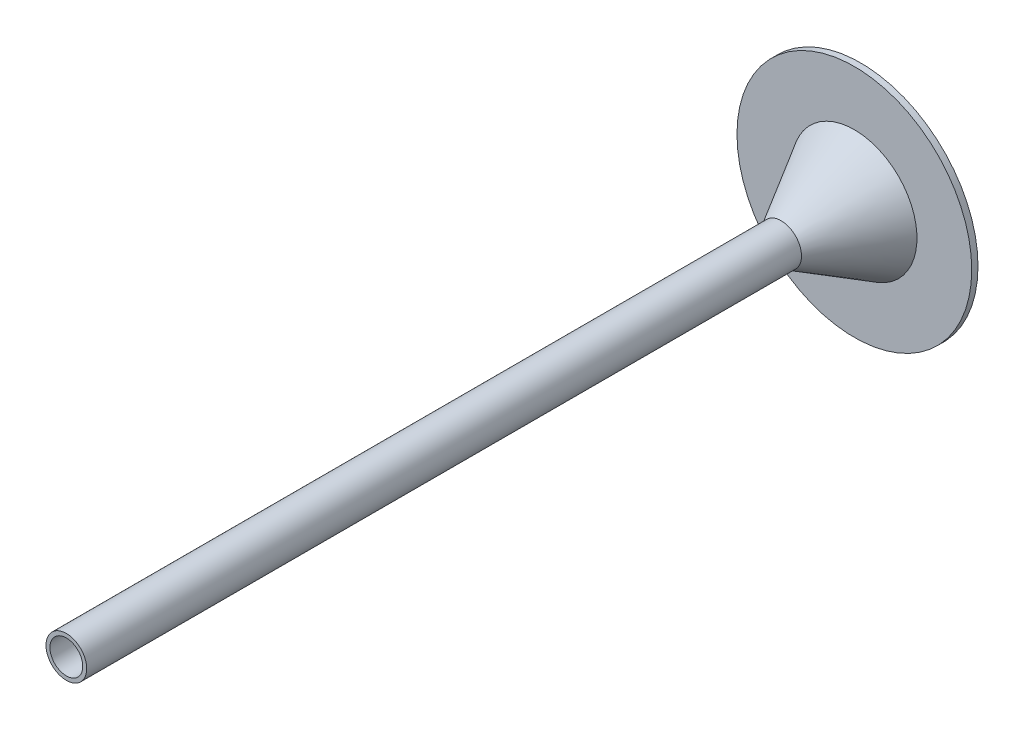
ISO-10303-21;
HEADER;
FILE_DESCRIPTION(('STEP AP214'),'2;1');
FILE_NAME('part.step','',(''),(''),'','','');
FILE_SCHEMA(('AUTOMOTIVE_DESIGN { 1 0 10303 214 1 1 1 1 }'));
ENDSEC;
DATA;
#1=APPLICATION_CONTEXT('core data for automotive mechanical design processes');
#2=APPLICATION_PROTOCOL_DEFINITION('international standard','automotive_design',2000,#1);
#3=PRODUCT_CONTEXT('',#1,'mechanical');
#4=PRODUCT('Part','Part','',(#3));
#5=PRODUCT_RELATED_PRODUCT_CATEGORY('part','',(#4));
#6=PRODUCT_DEFINITION_FORMATION('','',#4);
#7=PRODUCT_DEFINITION_CONTEXT('part definition',#1,'design');
#8=PRODUCT_DEFINITION('design','',#6,#7);
#9=PRODUCT_DEFINITION_SHAPE('','',#8);
#10=(LENGTH_UNIT() NAMED_UNIT(*) SI_UNIT(.MILLI.,.METRE.));
#11=(NAMED_UNIT(*) PLANE_ANGLE_UNIT() SI_UNIT($,.RADIAN.));
#12=(NAMED_UNIT(*) SI_UNIT($,.STERADIAN.) SOLID_ANGLE_UNIT());
#13=UNCERTAINTY_MEASURE_WITH_UNIT(LENGTH_MEASURE(1.E-05),#10,'distance_accuracy_value','');
#14=(GEOMETRIC_REPRESENTATION_CONTEXT(3) GLOBAL_UNCERTAINTY_ASSIGNED_CONTEXT((#13)) GLOBAL_UNIT_ASSIGNED_CONTEXT((#10,
#11,#12)) REPRESENTATION_CONTEXT('',''));
#15=CARTESIAN_POINT('',(0.,0.,0.));
#16=DIRECTION('',(0.,0.,1.));
#17=DIRECTION('',(1.,0.,0.));
#18=AXIS2_PLACEMENT_3D('',#15,#16,#17);
#19=CARTESIAN_POINT('',(0.,0.,1.6));
#20=DIRECTION('',(0.,0.,1.));
#21=DIRECTION('',(1.,0.,0.));
#22=AXIS2_PLACEMENT_3D('',#19,#20,#21);
#23=PLANE('',#22);
#24=CARTESIAN_POINT('',(0.,0.,1.6));
#25=DIRECTION('',(0.,0.,1.));
#26=DIRECTION('',(1.,0.,0.));
#27=AXIS2_PLACEMENT_3D('',#24,#25,#26);
#28=CIRCLE('',#27,16.);
#29=CARTESIAN_POINT('',(-16.,0.,1.6));
#30=VERTEX_POINT('',#29);
#31=EDGE_CURVE('E10',#30,#30,#28,.T.);
#32=ORIENTED_EDGE('',*,*,#31,.F.);
#33=EDGE_LOOP('',(#32));
#34=FACE_BOUND('',#33,.T.);
#35=CARTESIAN_POINT('',(0.,0.,1.6));
#36=DIRECTION('',(0.,0.,1.));
#37=DIRECTION('',(1.,0.,0.));
#38=AXIS2_PLACEMENT_3D('',#35,#36,#37);
#39=CIRCLE('',#38,30.);
#40=CARTESIAN_POINT('',(30.,0.,1.6));
#41=VERTEX_POINT('',#40);
#42=EDGE_CURVE('E38',#41,#41,#39,.T.);
#43=ORIENTED_EDGE('',*,*,#42,.T.);
#44=EDGE_LOOP('',(#43));
#45=FACE_BOUND('',#44,.T.);
#46=ADVANCED_FACE('F31',(#34,#45),#23,.T.);
#47=CARTESIAN_POINT('',(0.,0.,0.));
#48=DIRECTION('',(0.,0.,1.));
#49=DIRECTION('',(1.,0.,0.));
#50=AXIS2_PLACEMENT_3D('',#47,#48,#49);
#51=PLANE('',#50);
#52=CARTESIAN_POINT('',(0.,0.,0.));
#53=DIRECTION('',(0.,0.,1.));
#54=DIRECTION('',(1.,0.,0.));
#55=AXIS2_PLACEMENT_3D('',#52,#53,#54);
#56=CIRCLE('',#55,30.);
#57=CARTESIAN_POINT('',(30.,0.,0.));
#58=VERTEX_POINT('',#57);
#59=EDGE_CURVE('E42',#58,#58,#56,.T.);
#60=ORIENTED_EDGE('',*,*,#59,.F.);
#61=EDGE_LOOP('',(#60));
#62=FACE_BOUND('',#61,.T.);
#63=CARTESIAN_POINT('',(0.,0.,0.));
#64=DIRECTION('',(0.,0.,1.));
#65=DIRECTION('',(1.,0.,0.));
#66=AXIS2_PLACEMENT_3D('',#63,#64,#65);
#67=CIRCLE('',#66,15.);
#68=CARTESIAN_POINT('',(15.,0.,0.));
#69=VERTEX_POINT('',#68);
#70=EDGE_CURVE('E47',#69,#69,#67,.T.);
#71=ORIENTED_EDGE('',*,*,#70,.T.);
#72=EDGE_LOOP('',(#71));
#73=FACE_BOUND('',#72,.T.);
#74=ADVANCED_FACE('F85',(#62,#73),#51,.F.);
#75=CARTESIAN_POINT('',(0.,0.,1.6));
#76=DIRECTION('',(0.,0.,-1.));
#77=DIRECTION('',(-1.,0.,0.));
#78=AXIS2_PLACEMENT_3D('',#75,#76,#77);
#79=CYLINDRICAL_SURFACE('',#78,30.);
#80=ORIENTED_EDGE('',*,*,#42,.F.);
#81=EDGE_LOOP('',(#80));
#82=FACE_BOUND('',#81,.T.);
#83=ORIENTED_EDGE('',*,*,#59,.T.);
#84=EDGE_LOOP('',(#83));
#85=FACE_BOUND('',#84,.T.);
#86=ADVANCED_FACE('F33',(#82,#85),#79,.T.);
#87=CARTESIAN_POINT('',(0.,0.,1.6));
#88=DIRECTION('',(0.,0.,-1.));
#89=DIRECTION('',(-1.,0.,0.));
#90=AXIS2_PLACEMENT_3D('',#87,#88,#89);
#91=CYLINDRICAL_SURFACE('',#90,15.);
#92=CARTESIAN_POINT('',(0.,0.,1.6));
#93=DIRECTION('',(0.,0.,-1.));
#94=DIRECTION('',(-1.,0.,0.));
#95=AXIS2_PLACEMENT_3D('',#92,#93,#94);
#96=CIRCLE('',#95,15.);
#97=CARTESIAN_POINT('',(-15.,0.,1.6));
#98=VERTEX_POINT('',#97);
#99=EDGE_CURVE('E51',#98,#98,#96,.T.);
#100=ORIENTED_EDGE('',*,*,#99,.F.);
#101=EDGE_LOOP('',(#100));
#102=FACE_BOUND('',#101,.T.);
#103=ORIENTED_EDGE('',*,*,#70,.F.);
#104=EDGE_LOOP('',(#103));
#105=FACE_BOUND('',#104,.T.);
#106=ADVANCED_FACE('F93',(#102,#105),#91,.F.);
#107=CARTESIAN_POINT('',(0.,0.,20.3061487217437));
#108=DIRECTION('',(0.,0.,-1.));
#109=DIRECTION('',(-1.,0.,0.));
#110=AXIS2_PLACEMENT_3D('',#107,#108,#109);
#111=CONICAL_SURFACE('',#110,4.2,0.523598775598304);
#112=CARTESIAN_POINT('',(0.,0.,20.3061487217437));
#113=DIRECTION('',(0.,0.,-1.));
#114=DIRECTION('',(-1.,0.,0.));
#115=AXIS2_PLACEMENT_3D('',#112,#113,#114);
#116=CIRCLE('',#115,4.2);
#117=CARTESIAN_POINT('',(-4.2,0.,20.3061487217437));
#118=VERTEX_POINT('',#117);
#119=EDGE_CURVE('E54',#118,#118,#116,.T.);
#120=CARTESIAN_POINT('',(-15.,0.,1.6));
#121=CARTESIAN_POINT('',(-14.8875,0.,1.79485571585149));
#122=CARTESIAN_POINT('',(-14.775,0.,1.98971143170299));
#123=CARTESIAN_POINT('',(-14.55,0.,2.37942286340598));
#124=CARTESIAN_POINT('',(-14.4375,0.,2.57427857925748));
#125=CARTESIAN_POINT('',(-14.2125,0.,2.96399001096047));
#126=CARTESIAN_POINT('',(-14.1,0.,3.15884572681197));
#127=CARTESIAN_POINT('',(-13.875,0.,3.54855715851496));
#128=CARTESIAN_POINT('',(-13.7625,0.,3.74341287436646));
#129=CARTESIAN_POINT('',(-13.5375,0.,4.13312430606945));
#130=CARTESIAN_POINT('',(-13.425,0.,4.32798002192095));
#131=CARTESIAN_POINT('',(-13.2,0.,4.71769145362394));
#132=CARTESIAN_POINT('',(-13.0875,0.,4.91254716947543));
#133=CARTESIAN_POINT('',(-12.8625,0.,5.30225860117843));
#134=CARTESIAN_POINT('',(-12.75,0.,5.49711431702992));
#135=CARTESIAN_POINT('',(-12.525,0.,5.88682574873292));
#136=CARTESIAN_POINT('',(-12.4125,0.,6.08168146458441));
#137=CARTESIAN_POINT('',(-12.1875,0.,6.47139289628741));
#138=CARTESIAN_POINT('',(-12.075,0.,6.6662486121389));
#139=CARTESIAN_POINT('',(-11.85,0.,7.0559600438419));
#140=CARTESIAN_POINT('',(-11.7375,0.,7.25081575969339));
#141=CARTESIAN_POINT('',(-11.5125,0.,7.64052719139639));
#142=CARTESIAN_POINT('',(-11.4,0.,7.83538290724788));
#143=CARTESIAN_POINT('',(-11.175,0.,8.22509433895088));
#144=CARTESIAN_POINT('',(-11.0625,0.,8.41995005480237));
#145=CARTESIAN_POINT('',(-10.8375,0.,8.80966148650537));
#146=CARTESIAN_POINT('',(-10.725,0.,9.00451720235686));
#147=CARTESIAN_POINT('',(-10.5,0.,9.39422863405985));
#148=CARTESIAN_POINT('',(-10.3875,0.,9.58908434991135));
#149=CARTESIAN_POINT('',(-10.1625,0.,9.97879578161434));
#150=CARTESIAN_POINT('',(-10.05,0.,10.1736514974658));
#151=CARTESIAN_POINT('',(-9.825,0.,10.5633629291688));
#152=CARTESIAN_POINT('',(-9.7125,0.,10.7582186450203));
#153=CARTESIAN_POINT('',(-9.4875,0.,11.1479300767233));
#154=CARTESIAN_POINT('',(-9.375,0.,11.3427857925748));
#155=CARTESIAN_POINT('',(-9.15,0.,11.7324972242778));
#156=CARTESIAN_POINT('',(-9.0375,0.,11.9273529401293));
#157=CARTESIAN_POINT('',(-8.8125,0.,12.3170643718323));
#158=CARTESIAN_POINT('',(-8.7,0.,12.5119200876838));
#159=CARTESIAN_POINT('',(-8.475,0.,12.9016315193868));
#160=CARTESIAN_POINT('',(-8.3625,0.,13.0964872352383));
#161=CARTESIAN_POINT('',(-8.1375,0.,13.4861986669413));
#162=CARTESIAN_POINT('',(-8.025,0.,13.6810543827928));
#163=CARTESIAN_POINT('',(-7.8,0.,14.0707658144958));
#164=CARTESIAN_POINT('',(-7.6875,0.,14.2656215303473));
#165=CARTESIAN_POINT('',(-7.4625,0.,14.6553329620503));
#166=CARTESIAN_POINT('',(-7.35,0.,14.8501886779018));
#167=CARTESIAN_POINT('',(-7.125,0.,15.2399001096048));
#168=CARTESIAN_POINT('',(-7.0125,0.,15.4347558254562));
#169=CARTESIAN_POINT('',(-6.7875,0.,15.8244672571592));
#170=CARTESIAN_POINT('',(-6.675,0.,16.0193229730107));
#171=CARTESIAN_POINT('',(-6.45,0.,16.4090344047137));
#172=CARTESIAN_POINT('',(-6.3375,0.,16.6038901205652));
#173=CARTESIAN_POINT('',(-6.1125,0.,16.9936015522682));
#174=CARTESIAN_POINT('',(-6.,0.,17.1884572681197));
#175=CARTESIAN_POINT('',(-5.775,0.,17.5781686998227));
#176=CARTESIAN_POINT('',(-5.6625,0.,17.7730244156742));
#177=CARTESIAN_POINT('',(-5.4375,0.,18.1627358473772));
#178=CARTESIAN_POINT('',(-5.325,0.,18.3575915632287));
#179=CARTESIAN_POINT('',(-5.1,0.,18.7473029949317));
#180=CARTESIAN_POINT('',(-4.9875,0.,18.9421587107832));
#181=CARTESIAN_POINT('',(-4.76249999999999,0.,19.3318701424862));
#182=CARTESIAN_POINT('',(-4.65,0.,19.5267258583377));
#183=CARTESIAN_POINT('',(-4.425,0.,19.9164372900407));
#184=CARTESIAN_POINT('',(-4.3125,0.,20.1112930058922));
#185=CARTESIAN_POINT('',(-4.2,0.,20.3061487217437));
#186=B_SPLINE_CURVE_WITH_KNOTS('',3,(#120,#121,#122,#123,#124,#125,#126,#127,#128,#129,#130,
#131,#132,#133,#134,#135,#136,#137,#138,#139,#140,#141,#142,#143,#144,#145,#146,#147,#148,#149,
#150,#151,#152,#153,#154,#155,#156,#157,#158,#159,#160,#161,#162,#163,#164,#165,#166,#167,#168,
#169,#170,#171,#172,#173,#174,#175,#176,#177,#178,#179,#180,#181,#182,#183,#184,#185),
.UNSPECIFIED.,.F.,.F.,(4,2,2,2,2,2,2,2,2,2,2,2,2,2,2,2,2,2,2,2,2,2,2,2,2,2,2,2,2,2,2,2,4),(0.,
0.674999999999996,1.34999999999999,2.02499999999998,2.69999999999998,3.37499999999997,
4.04999999999996,4.72499999999996,5.39999999999995,6.07499999999995,6.74999999999994,
7.42499999999994,8.09999999999993,8.77499999999993,9.44999999999992,10.1249999999999,
10.7999999999999,11.4749999999999,12.1499999999999,12.8249999999999,13.4999999999999,
14.1749999999999,14.8499999999999,15.5249999999999,16.1999999999999,16.8749999999999,
17.5499999999999,18.2249999999998,18.8999999999998,19.5749999999998,20.2499999999998,
20.9249999999998,21.5999999999998),.UNSPECIFIED.);
#187=EDGE_CURVE('BSEAM81',#98,#118,#186,.T.);
#188=ORIENTED_EDGE('',*,*,#99,.T.);
#189=ORIENTED_EDGE('',*,*,#119,.F.);
#190=ORIENTED_EDGE('',*,*,#187,.T.);
#191=ORIENTED_EDGE('',*,*,#187,.F.);
#192=EDGE_LOOP('',(#188,#190,#189,#191));
#193=FACE_BOUND('',#192,.T.);
#194=ADVANCED_FACE('F81',(#193),#111,.F.);
#195=CARTESIAN_POINT('',(0.,0.,1.6));
#196=DIRECTION('',(0.,0.,-1.));
#197=DIRECTION('',(-1.,0.,0.));
#198=AXIS2_PLACEMENT_3D('',#195,#196,#197);
#199=CONICAL_SURFACE('',#198,16.,0.523598775598304);
#200=CARTESIAN_POINT('',(0.,0.,20.3061487217437));
#201=DIRECTION('',(0.,0.,1.));
#202=DIRECTION('',(1.,0.,0.));
#203=AXIS2_PLACEMENT_3D('',#200,#201,#202);
#204=CIRCLE('',#203,5.2);
#205=CARTESIAN_POINT('',(-5.2,0.,20.3061487217437));
#206=VERTEX_POINT('',#205);
#207=EDGE_CURVE('E61',#206,#206,#204,.T.);
#208=CARTESIAN_POINT('',(-5.2,0.,20.3061487217437));
#209=CARTESIAN_POINT('',(-5.3125,0.,20.1112930058922));
#210=CARTESIAN_POINT('',(-5.425,0.,19.9164372900407));
#211=CARTESIAN_POINT('',(-5.65,0.,19.5267258583377));
#212=CARTESIAN_POINT('',(-5.7625,0.,19.3318701424862));
#213=CARTESIAN_POINT('',(-5.9875,0.,18.9421587107832));
#214=CARTESIAN_POINT('',(-6.1,0.,18.7473029949317));
#215=CARTESIAN_POINT('',(-6.325,0.,18.3575915632287));
#216=CARTESIAN_POINT('',(-6.4375,0.,18.1627358473772));
#217=CARTESIAN_POINT('',(-6.6625,0.,17.7730244156742));
#218=CARTESIAN_POINT('',(-6.775,0.,17.5781686998227));
#219=CARTESIAN_POINT('',(-7.,0.,17.1884572681197));
#220=CARTESIAN_POINT('',(-7.1125,0.,16.9936015522682));
#221=CARTESIAN_POINT('',(-7.3375,0.,16.6038901205652));
#222=CARTESIAN_POINT('',(-7.45,0.,16.4090344047137));
#223=CARTESIAN_POINT('',(-7.675,0.,16.0193229730107));
#224=CARTESIAN_POINT('',(-7.7875,0.,15.8244672571592));
#225=CARTESIAN_POINT('',(-8.0125,0.,15.4347558254563));
#226=CARTESIAN_POINT('',(-8.125,0.,15.2399001096048));
#227=CARTESIAN_POINT('',(-8.35,0.,14.8501886779018));
#228=CARTESIAN_POINT('',(-8.4625,0.,14.6553329620503));
#229=CARTESIAN_POINT('',(-8.6875,0.,14.2656215303473));
#230=CARTESIAN_POINT('',(-8.8,0.,14.0707658144958));
#231=CARTESIAN_POINT('',(-9.025,0.,13.6810543827928));
#232=CARTESIAN_POINT('',(-9.1375,0.,13.4861986669413));
#233=CARTESIAN_POINT('',(-9.3625,0.,13.0964872352383));
#234=CARTESIAN_POINT('',(-9.475,0.,12.9016315193868));
#235=CARTESIAN_POINT('',(-9.7,0.,12.5119200876838));
#236=CARTESIAN_POINT('',(-9.8125,0.,12.3170643718323));
#237=CARTESIAN_POINT('',(-10.0375,0.,11.9273529401293));
#238=CARTESIAN_POINT('',(-10.15,0.,11.7324972242778));
#239=CARTESIAN_POINT('',(-10.375,0.,11.3427857925748));
#240=CARTESIAN_POINT('',(-10.4875,0.,11.1479300767233));
#241=CARTESIAN_POINT('',(-10.7125,0.,10.7582186450203));
#242=CARTESIAN_POINT('',(-10.825,0.,10.5633629291688));
#243=CARTESIAN_POINT('',(-11.05,0.,10.1736514974658));
#244=CARTESIAN_POINT('',(-11.1625,0.,9.97879578161435));
#245=CARTESIAN_POINT('',(-11.3875,0.,9.58908434991135));
#246=CARTESIAN_POINT('',(-11.5,0.,9.39422863405986));
#247=CARTESIAN_POINT('',(-11.725,0.,9.00451720235687));
#248=CARTESIAN_POINT('',(-11.8375,0.,8.80966148650537));
#249=CARTESIAN_POINT('',(-12.0625,0.,8.41995005480238));
#250=CARTESIAN_POINT('',(-12.175,0.,8.22509433895088));
#251=CARTESIAN_POINT('',(-12.4,0.,7.83538290724789));
#252=CARTESIAN_POINT('',(-12.5125,0.,7.64052719139639));
#253=CARTESIAN_POINT('',(-12.7375,0.,7.2508157596934));
#254=CARTESIAN_POINT('',(-12.85,0.,7.0559600438419));
#255=CARTESIAN_POINT('',(-13.075,0.,6.66624861213891));
#256=CARTESIAN_POINT('',(-13.1875,0.,6.47139289628741));
#257=CARTESIAN_POINT('',(-13.4125,0.,6.08168146458442));
#258=CARTESIAN_POINT('',(-13.525,0.,5.88682574873292));
#259=CARTESIAN_POINT('',(-13.75,0.,5.49711431702993));
#260=CARTESIAN_POINT('',(-13.8625,0.,5.30225860117843));
#261=CARTESIAN_POINT('',(-14.0875,0.,4.91254716947544));
#262=CARTESIAN_POINT('',(-14.2,0.,4.71769145362394));
#263=CARTESIAN_POINT('',(-14.425,0.,4.32798002192095));
#264=CARTESIAN_POINT('',(-14.5375,0.,4.13312430606945));
#265=CARTESIAN_POINT('',(-14.7625,0.,3.74341287436646));
#266=CARTESIAN_POINT('',(-14.875,0.,3.54855715851496));
#267=CARTESIAN_POINT('',(-15.1,0.,3.15884572681197));
#268=CARTESIAN_POINT('',(-15.2125,0.,2.96399001096047));
#269=CARTESIAN_POINT('',(-15.4375,0.,2.57427857925748));
#270=CARTESIAN_POINT('',(-15.55,0.,2.37942286340599));
#271=CARTESIAN_POINT('',(-15.775,0.,1.98971143170299));
#272=CARTESIAN_POINT('',(-15.8875,0.,1.7948557158515));
#273=CARTESIAN_POINT('',(-16.,0.,1.6));
#274=B_SPLINE_CURVE_WITH_KNOTS('',3,(#208,#209,#210,#211,#212,#213,#214,#215,#216,#217,#218,
#219,#220,#221,#222,#223,#224,#225,#226,#227,#228,#229,#230,#231,#232,#233,#234,#235,#236,#237,
#238,#239,#240,#241,#242,#243,#244,#245,#246,#247,#248,#249,#250,#251,#252,#253,#254,#255,#256,
#257,#258,#259,#260,#261,#262,#263,#264,#265,#266,#267,#268,#269,#270,#271,#272,#273),
.UNSPECIFIED.,.F.,.F.,(4,2,2,2,2,2,2,2,2,2,2,2,2,2,2,2,2,2,2,2,2,2,2,2,2,2,2,2,2,2,2,2,4),(0.,
0.674999999999996,1.34999999999999,2.02499999999998,2.69999999999998,3.37499999999997,
4.04999999999997,4.72499999999996,5.39999999999995,6.07499999999995,6.74999999999994,
7.42499999999994,8.09999999999993,8.77499999999993,9.44999999999992,10.1249999999999,
10.7999999999999,11.4749999999999,12.1499999999999,12.8249999999999,13.4999999999999,
14.1749999999999,14.8499999999999,15.5249999999999,16.1999999999999,16.8749999999999,
17.5499999999999,18.2249999999998,18.8999999999998,19.5749999999998,20.2499999999998,
20.9249999999998,21.5999999999998),.UNSPECIFIED.);
#275=EDGE_CURVE('BSEAM72',#206,#30,#274,.T.);
#276=ORIENTED_EDGE('',*,*,#207,.F.);
#277=ORIENTED_EDGE('',*,*,#31,.T.);
#278=ORIENTED_EDGE('',*,*,#275,.T.);
#279=ORIENTED_EDGE('',*,*,#275,.F.);
#280=EDGE_LOOP('',(#276,#278,#277,#279));
#281=FACE_BOUND('',#280,.T.);
#282=ADVANCED_FACE('F72',(#281),#199,.T.);
#283=CARTESIAN_POINT('',(0.,0.,217.70782104868));
#284=DIRECTION('',(0.,0.,-1.));
#285=DIRECTION('',(-1.,0.,0.));
#286=AXIS2_PLACEMENT_3D('',#283,#284,#285);
#287=CYLINDRICAL_SURFACE('',#286,5.2);
#288=CARTESIAN_POINT('',(0.,0.,203.));
#289=DIRECTION('',(0.,0.,1.));
#290=DIRECTION('',(1.,0.,0.));
#291=AXIS2_PLACEMENT_3D('',#288,#289,#290);
#292=CIRCLE('',#291,5.2);
#293=CARTESIAN_POINT('',(-5.2,0.,203.));
#294=VERTEX_POINT('',#293);
#295=EDGE_CURVE('E57',#294,#294,#292,.T.);
#296=CARTESIAN_POINT('',(-5.2,0.,20.3061487217437));
#297=CARTESIAN_POINT('',(-5.2,0.,22.2092096725588));
#298=CARTESIAN_POINT('',(-5.2,0.,24.112270623374));
#299=CARTESIAN_POINT('',(-5.2,0.,27.9183925250043));
#300=CARTESIAN_POINT('',(-5.2,0.,29.8214534758195));
#301=CARTESIAN_POINT('',(-5.2,0.,33.6275753774499));
#302=CARTESIAN_POINT('',(-5.2,0.,35.530636328265));
#303=CARTESIAN_POINT('',(-5.2,0.,39.3367582298954));
#304=CARTESIAN_POINT('',(-5.2,0.,41.2398191807105));
#305=CARTESIAN_POINT('',(-5.2,0.,45.0459410823409));
#306=CARTESIAN_POINT('',(-5.2,0.,46.949002033156));
#307=CARTESIAN_POINT('',(-5.2,0.,50.7551239347864));
#308=CARTESIAN_POINT('',(-5.2,0.,52.6581848856016));
#309=CARTESIAN_POINT('',(-5.2,0.,56.4643067872319));
#310=CARTESIAN_POINT('',(-5.2,0.,58.3673677380471));
#311=CARTESIAN_POINT('',(-5.2,0.,62.1734896396774));
#312=CARTESIAN_POINT('',(-5.2,0.,64.0765505904926));
#313=CARTESIAN_POINT('',(-5.2,0.,67.8826724921229));
#314=CARTESIAN_POINT('',(-5.2,0.,69.7857334429381));
#315=CARTESIAN_POINT('',(-5.2,0.,73.5918553445684));
#316=CARTESIAN_POINT('',(-5.2,0.,75.4949162953836));
#317=CARTESIAN_POINT('',(-5.2,0.,79.3010381970139));
#318=CARTESIAN_POINT('',(-5.2,0.,81.2040991478291));
#319=CARTESIAN_POINT('',(-5.2,0.,85.0102210494595));
#320=CARTESIAN_POINT('',(-5.2,0.,86.9132820002746));
#321=CARTESIAN_POINT('',(-5.2,0.,90.719403901905));
#322=CARTESIAN_POINT('',(-5.2,0.,92.6224648527201));
#323=CARTESIAN_POINT('',(-5.2,0.,96.4285867543505));
#324=CARTESIAN_POINT('',(-5.2,0.,98.3316477051656));
#325=CARTESIAN_POINT('',(-5.2,0.,102.137769606796));
#326=CARTESIAN_POINT('',(-5.2,0.,104.040830557611));
#327=CARTESIAN_POINT('',(-5.2,0.,107.846952459241));
#328=CARTESIAN_POINT('',(-5.2,0.,109.750013410057));
#329=CARTESIAN_POINT('',(-5.2,0.,113.556135311687));
#330=CARTESIAN_POINT('',(-5.2,0.,115.459196262502));
#331=CARTESIAN_POINT('',(-5.2,0.,119.265318164133));
#332=CARTESIAN_POINT('',(-5.2,0.,121.168379114948));
#333=CARTESIAN_POINT('',(-5.2,0.,124.974501016578));
#334=CARTESIAN_POINT('',(-5.2,0.,126.877561967393));
#335=CARTESIAN_POINT('',(-5.2,0.,130.683683869024));
#336=CARTESIAN_POINT('',(-5.2,0.,132.586744819839));
#337=CARTESIAN_POINT('',(-5.2,0.,136.392866721469));
#338=CARTESIAN_POINT('',(-5.2,0.,138.295927672284));
#339=CARTESIAN_POINT('',(-5.2,0.,142.102049573915));
#340=CARTESIAN_POINT('',(-5.2,0.,144.00511052473));
#341=CARTESIAN_POINT('',(-5.2,0.,147.81123242636));
#342=CARTESIAN_POINT('',(-5.2,0.,149.714293377175));
#343=CARTESIAN_POINT('',(-5.2,0.,153.520415278806));
#344=CARTESIAN_POINT('',(-5.2,0.,155.423476229621));
#345=CARTESIAN_POINT('',(-5.2,0.,159.229598131251));
#346=CARTESIAN_POINT('',(-5.2,0.,161.132659082066));
#347=CARTESIAN_POINT('',(-5.2,0.,164.938780983697));
#348=CARTESIAN_POINT('',(-5.2,0.,166.841841934512));
#349=CARTESIAN_POINT('',(-5.2,0.,170.647963836142));
#350=CARTESIAN_POINT('',(-5.2,0.,172.551024786957));
#351=CARTESIAN_POINT('',(-5.2,0.,176.357146688588));
#352=CARTESIAN_POINT('',(-5.2,0.,178.260207639403));
#353=CARTESIAN_POINT('',(-5.2,0.,182.066329541033));
#354=CARTESIAN_POINT('',(-5.2,0.,183.969390491848));
#355=CARTESIAN_POINT('',(-5.2,0.,187.775512393479));
#356=CARTESIAN_POINT('',(-5.2,0.,189.678573344294));
#357=CARTESIAN_POINT('',(-5.2,0.,193.484695245924));
#358=CARTESIAN_POINT('',(-5.2,0.,195.387756196739));
#359=CARTESIAN_POINT('',(-5.2,0.,199.19387809837));
#360=CARTESIAN_POINT('',(-5.2,0.,201.096939049185));
#361=CARTESIAN_POINT('',(-5.2,0.,203.));
#362=B_SPLINE_CURVE_WITH_KNOTS('',3,(#296,#297,#298,#299,#300,#301,#302,#303,#304,#305,#306,
#307,#308,#309,#310,#311,#312,#313,#314,#315,#316,#317,#318,#319,#320,#321,#322,#323,#324,#325,
#326,#327,#328,#329,#330,#331,#332,#333,#334,#335,#336,#337,#338,#339,#340,#341,#342,#343,#344,
#345,#346,#347,#348,#349,#350,#351,#352,#353,#354,#355,#356,#357,#358,#359,#360,#361),
.UNSPECIFIED.,.F.,.F.,(4,2,2,2,2,2,2,2,2,2,2,2,2,2,2,2,2,2,2,2,2,2,2,2,2,2,2,2,2,2,2,2,4),(0.,
5.70918285244551,11.418365704891,17.1275485573365,22.836731409782,28.5459142622276,
34.2550971146731,39.9642799671186,45.6734628195641,51.3826456720096,57.0918285244551,
62.8010113769006,68.5101942293461,74.2193770817916,79.9285599342371,85.6377427866827,
91.3469256391282,97.0561084915737,102.765291344019,108.474474196465,114.18365704891,
119.892839901356,125.602022753801,131.311205606247,137.020388458692,142.729571311138,
148.438754163583,154.147937016029,159.857119868474,165.56630272092,171.275485573365,
176.984668425811,182.693851278256),.UNSPECIFIED.);
#363=EDGE_CURVE('BSEAM69',#206,#294,#362,.T.);
#364=ORIENTED_EDGE('',*,*,#207,.T.);
#365=ORIENTED_EDGE('',*,*,#295,.F.);
#366=ORIENTED_EDGE('',*,*,#363,.T.);
#367=ORIENTED_EDGE('',*,*,#363,.F.);
#368=EDGE_LOOP('',(#364,#366,#365,#367));
#369=FACE_BOUND('',#368,.T.);
#370=ADVANCED_FACE('F69',(#369),#287,.T.);
#371=CARTESIAN_POINT('',(0.,0.,217.70782104868));
#372=DIRECTION('',(0.,0.,-1.));
#373=DIRECTION('',(-1.,0.,0.));
#374=AXIS2_PLACEMENT_3D('',#371,#372,#373);
#375=CYLINDRICAL_SURFACE('',#374,4.2);
#376=CARTESIAN_POINT('',(0.,0.,203.));
#377=DIRECTION('',(0.,0.,1.));
#378=DIRECTION('',(1.,0.,0.));
#379=AXIS2_PLACEMENT_3D('',#376,#377,#378);
#380=CIRCLE('',#379,4.2);
#381=CARTESIAN_POINT('',(-4.2,0.,203.));
#382=VERTEX_POINT('',#381);
#383=EDGE_CURVE('E58',#382,#382,#380,.T.);
#384=CARTESIAN_POINT('',(-4.2,0.,20.3061487217437));
#385=CARTESIAN_POINT('',(-4.2,0.,22.2092096725588));
#386=CARTESIAN_POINT('',(-4.2,0.,24.112270623374));
#387=CARTESIAN_POINT('',(-4.2,0.,27.9183925250043));
#388=CARTESIAN_POINT('',(-4.2,0.,29.8214534758195));
#389=CARTESIAN_POINT('',(-4.2,0.,33.6275753774499));
#390=CARTESIAN_POINT('',(-4.2,0.,35.530636328265));
#391=CARTESIAN_POINT('',(-4.2,0.,39.3367582298954));
#392=CARTESIAN_POINT('',(-4.2,0.,41.2398191807105));
#393=CARTESIAN_POINT('',(-4.2,0.,45.0459410823409));
#394=CARTESIAN_POINT('',(-4.2,0.,46.949002033156));
#395=CARTESIAN_POINT('',(-4.2,0.,50.7551239347864));
#396=CARTESIAN_POINT('',(-4.2,0.,52.6581848856016));
#397=CARTESIAN_POINT('',(-4.2,0.,56.4643067872319));
#398=CARTESIAN_POINT('',(-4.2,0.,58.3673677380471));
#399=CARTESIAN_POINT('',(-4.2,0.,62.1734896396774));
#400=CARTESIAN_POINT('',(-4.2,0.,64.0765505904926));
#401=CARTESIAN_POINT('',(-4.2,0.,67.8826724921229));
#402=CARTESIAN_POINT('',(-4.2,0.,69.7857334429381));
#403=CARTESIAN_POINT('',(-4.2,0.,73.5918553445684));
#404=CARTESIAN_POINT('',(-4.2,0.,75.4949162953836));
#405=CARTESIAN_POINT('',(-4.2,0.,79.3010381970139));
#406=CARTESIAN_POINT('',(-4.2,0.,81.2040991478291));
#407=CARTESIAN_POINT('',(-4.2,0.,85.0102210494595));
#408=CARTESIAN_POINT('',(-4.2,0.,86.9132820002746));
#409=CARTESIAN_POINT('',(-4.2,0.,90.719403901905));
#410=CARTESIAN_POINT('',(-4.2,0.,92.6224648527201));
#411=CARTESIAN_POINT('',(-4.2,0.,96.4285867543505));
#412=CARTESIAN_POINT('',(-4.2,0.,98.3316477051656));
#413=CARTESIAN_POINT('',(-4.2,0.,102.137769606796));
#414=CARTESIAN_POINT('',(-4.2,0.,104.040830557611));
#415=CARTESIAN_POINT('',(-4.2,0.,107.846952459241));
#416=CARTESIAN_POINT('',(-4.2,0.,109.750013410057));
#417=CARTESIAN_POINT('',(-4.2,0.,113.556135311687));
#418=CARTESIAN_POINT('',(-4.2,0.,115.459196262502));
#419=CARTESIAN_POINT('',(-4.2,0.,119.265318164133));
#420=CARTESIAN_POINT('',(-4.2,0.,121.168379114948));
#421=CARTESIAN_POINT('',(-4.2,0.,124.974501016578));
#422=CARTESIAN_POINT('',(-4.2,0.,126.877561967393));
#423=CARTESIAN_POINT('',(-4.2,0.,130.683683869024));
#424=CARTESIAN_POINT('',(-4.2,0.,132.586744819839));
#425=CARTESIAN_POINT('',(-4.2,0.,136.392866721469));
#426=CARTESIAN_POINT('',(-4.2,0.,138.295927672284));
#427=CARTESIAN_POINT('',(-4.2,0.,142.102049573915));
#428=CARTESIAN_POINT('',(-4.2,0.,144.00511052473));
#429=CARTESIAN_POINT('',(-4.2,0.,147.81123242636));
#430=CARTESIAN_POINT('',(-4.2,0.,149.714293377175));
#431=CARTESIAN_POINT('',(-4.2,0.,153.520415278806));
#432=CARTESIAN_POINT('',(-4.2,0.,155.423476229621));
#433=CARTESIAN_POINT('',(-4.2,0.,159.229598131251));
#434=CARTESIAN_POINT('',(-4.2,0.,161.132659082066));
#435=CARTESIAN_POINT('',(-4.2,0.,164.938780983697));
#436=CARTESIAN_POINT('',(-4.2,0.,166.841841934512));
#437=CARTESIAN_POINT('',(-4.2,0.,170.647963836142));
#438=CARTESIAN_POINT('',(-4.2,0.,172.551024786957));
#439=CARTESIAN_POINT('',(-4.2,0.,176.357146688588));
#440=CARTESIAN_POINT('',(-4.2,0.,178.260207639403));
#441=CARTESIAN_POINT('',(-4.2,0.,182.066329541033));
#442=CARTESIAN_POINT('',(-4.2,0.,183.969390491848));
#443=CARTESIAN_POINT('',(-4.2,0.,187.775512393479));
#444=CARTESIAN_POINT('',(-4.2,0.,189.678573344294));
#445=CARTESIAN_POINT('',(-4.2,0.,193.484695245924));
#446=CARTESIAN_POINT('',(-4.2,0.,195.387756196739));
#447=CARTESIAN_POINT('',(-4.2,0.,199.19387809837));
#448=CARTESIAN_POINT('',(-4.2,0.,201.096939049185));
#449=CARTESIAN_POINT('',(-4.2,0.,203.));
#450=B_SPLINE_CURVE_WITH_KNOTS('',3,(#384,#385,#386,#387,#388,#389,#390,#391,#392,#393,#394,
#395,#396,#397,#398,#399,#400,#401,#402,#403,#404,#405,#406,#407,#408,#409,#410,#411,#412,#413,
#414,#415,#416,#417,#418,#419,#420,#421,#422,#423,#424,#425,#426,#427,#428,#429,#430,#431,#432,
#433,#434,#435,#436,#437,#438,#439,#440,#441,#442,#443,#444,#445,#446,#447,#448,#449),
.UNSPECIFIED.,.F.,.F.,(4,2,2,2,2,2,2,2,2,2,2,2,2,2,2,2,2,2,2,2,2,2,2,2,2,2,2,2,2,2,2,2,4),(0.,
5.70918285244551,11.418365704891,17.1275485573365,22.836731409782,28.5459142622276,
34.2550971146731,39.9642799671186,45.6734628195641,51.3826456720096,57.0918285244551,
62.8010113769006,68.5101942293461,74.2193770817916,79.9285599342371,85.6377427866827,
91.3469256391282,97.0561084915737,102.765291344019,108.474474196465,114.18365704891,
119.892839901356,125.602022753801,131.311205606247,137.020388458692,142.729571311138,
148.438754163583,154.147937016029,159.857119868474,165.56630272092,171.275485573365,
176.984668425811,182.693851278256),.UNSPECIFIED.);
#451=EDGE_CURVE('BSEAM71',#118,#382,#450,.T.);
#452=ORIENTED_EDGE('',*,*,#119,.T.);
#453=ORIENTED_EDGE('',*,*,#383,.T.);
#454=ORIENTED_EDGE('',*,*,#451,.T.);
#455=ORIENTED_EDGE('',*,*,#451,.F.);
#456=EDGE_LOOP('',(#452,#454,#453,#455));
#457=FACE_BOUND('',#456,.T.);
#458=ADVANCED_FACE('F71',(#457),#375,.F.);
#459=CARTESIAN_POINT('',(0.,0.,203.));
#460=DIRECTION('',(0.,0.,1.));
#461=DIRECTION('',(0.,1.,0.));
#462=AXIS2_PLACEMENT_3D('',#459,#460,#461);
#463=PLANE('',#462);
#464=ORIENTED_EDGE('',*,*,#383,.F.);
#465=EDGE_LOOP('',(#464));
#466=FACE_BOUND('',#465,.T.);
#467=ORIENTED_EDGE('',*,*,#295,.T.);
#468=EDGE_LOOP('',(#467));
#469=FACE_BOUND('',#468,.T.);
#470=ADVANCED_FACE('F67',(#466,#469),#463,.T.);
#471=CLOSED_SHELL('',(#46,#74,#86,#106,#194,#282,#370,#458,#470));
#472=MANIFOLD_SOLID_BREP('B2',#471);
#473=ADVANCED_BREP_SHAPE_REPRESENTATION('',(#18,#472),#14);
#474=SHAPE_DEFINITION_REPRESENTATION(#9,#473);
ENDSEC;
END-ISO-10303-21;
